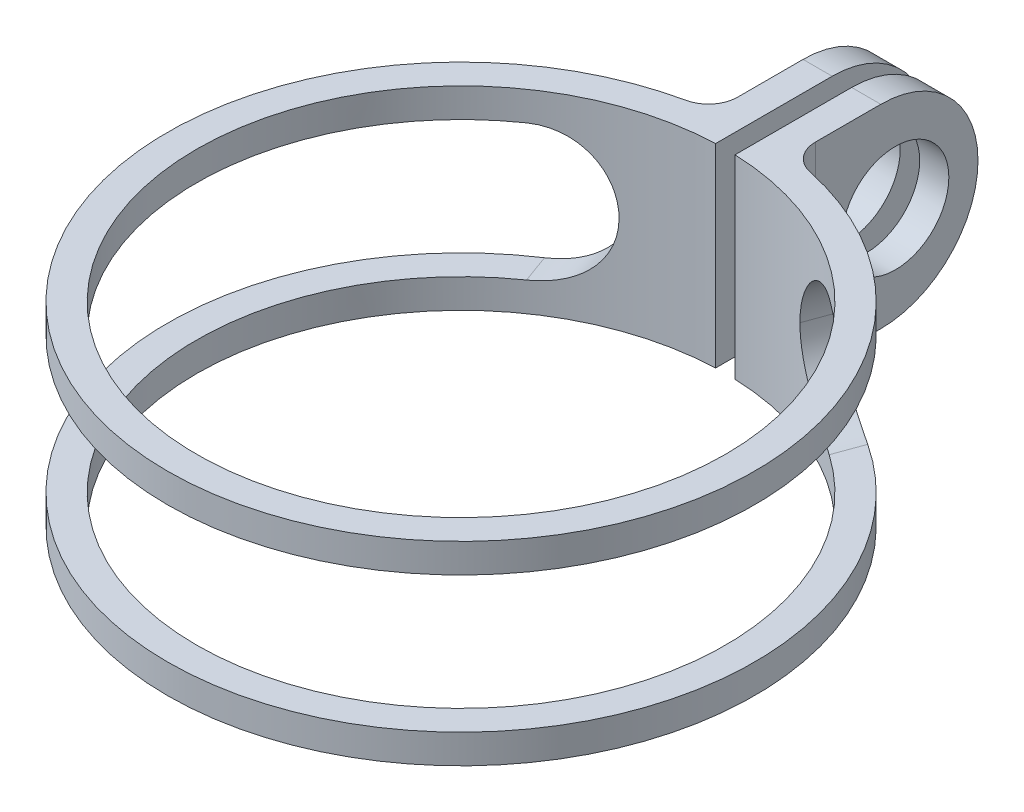
ISO-10303-21;
HEADER;
FILE_DESCRIPTION(('STEP AP214'),'2;1');
FILE_NAME('part.step','',(''),(''),'','','');
FILE_SCHEMA(('AUTOMOTIVE_DESIGN { 1 0 10303 214 1 1 1 1 }'));
ENDSEC;
DATA;
#1=APPLICATION_CONTEXT('core data for automotive mechanical design processes');
#2=APPLICATION_PROTOCOL_DEFINITION('international standard','automotive_design',2000,#1);
#3=PRODUCT_CONTEXT('',#1,'mechanical');
#4=PRODUCT('Part','Part','',(#3));
#5=PRODUCT_RELATED_PRODUCT_CATEGORY('part','',(#4));
#6=PRODUCT_DEFINITION_FORMATION('','',#4);
#7=PRODUCT_DEFINITION_CONTEXT('part definition',#1,'design');
#8=PRODUCT_DEFINITION('design','',#6,#7);
#9=PRODUCT_DEFINITION_SHAPE('','',#8);
#10=(LENGTH_UNIT() NAMED_UNIT(*) SI_UNIT(.MILLI.,.METRE.));
#11=(NAMED_UNIT(*) PLANE_ANGLE_UNIT() SI_UNIT($,.RADIAN.));
#12=(NAMED_UNIT(*) SI_UNIT($,.STERADIAN.) SOLID_ANGLE_UNIT());
#13=UNCERTAINTY_MEASURE_WITH_UNIT(LENGTH_MEASURE(1.E-05),#10,'distance_accuracy_value','');
#14=(GEOMETRIC_REPRESENTATION_CONTEXT(3) GLOBAL_UNCERTAINTY_ASSIGNED_CONTEXT((#13)) GLOBAL_UNIT_ASSIGNED_CONTEXT((#10,
#11,#12)) REPRESENTATION_CONTEXT('',''));
#15=CARTESIAN_POINT('',(0.,0.,0.));
#16=DIRECTION('',(0.,0.,1.));
#17=DIRECTION('',(1.,0.,0.));
#18=AXIS2_PLACEMENT_3D('',#15,#16,#17);
#19=CARTESIAN_POINT('',(0.,10.,0.));
#20=DIRECTION('',(0.,-1.,0.));
#21=DIRECTION('',(0.,0.,-1.));
#22=AXIS2_PLACEMENT_3D('',#19,#20,#21);
#23=CYLINDRICAL_SURFACE('',#22,15.1);
#24=CARTESIAN_POINT('',(0.,8.5,0.));
#25=DIRECTION('',(0.,1.,0.));
#26=DIRECTION('',(0.,0.,1.));
#27=AXIS2_PLACEMENT_3D('',#24,#25,#26);
#28=CIRCLE('',#27,15.1);
#29=CARTESIAN_POINT('',(-8.31277981123432,8.5,-12.605859423694));
#30=VERTEX_POINT('',#29);
#31=CARTESIAN_POINT('',(8.31277981123432,8.5,-12.605859423694));
#32=VERTEX_POINT('',#31);
#33=EDGE_CURVE('E357',#30,#32,#28,.T.);
#34=ORIENTED_EDGE('',*,*,#33,.T.);
#35=CARTESIAN_POINT('',(8.31277981123432,8.5,-12.605859423694));
#36=CARTESIAN_POINT('',(8.23081119365416,8.50000986269873,-12.6599231711339));
#37=CARTESIAN_POINT('',(8.14830236853744,8.49608979926422,-12.7131749706866));
#38=CARTESIAN_POINT('',(7.98279785800521,8.48035203292611,-12.8177397302163));
#39=CARTESIAN_POINT('',(7.89980211467017,8.46853337078762,-12.8690524539049));
#40=CARTESIAN_POINT('',(7.73396711486584,8.43696623126963,-12.9693929263964));
#41=CARTESIAN_POINT('',(7.65112781313249,8.4172205843794,-13.01842148384));
#42=CARTESIAN_POINT('',(7.48626354607359,8.36987211157906,-13.1139221316061));
#43=CARTESIAN_POINT('',(7.40423852722173,8.34226980570783,-13.1603943908892));
#44=CARTESIAN_POINT('',(7.16015287882387,8.24772625016357,-13.2957393175927));
#45=CARTESIAN_POINT('',(7.00015777474126,8.16906274682416,-13.3804943431177));
#46=CARTESIAN_POINT('',(6.69167087332782,7.98252376494462,-13.5374147169593));
#47=CARTESIAN_POINT('',(6.54317389024262,7.87466155513694,-13.6095857593674));
#48=CARTESIAN_POINT('',(6.2646699978317,7.63434111962348,-13.7399871600411));
#49=CARTESIAN_POINT('',(6.13443607786597,7.50224310431098,-13.7983962612636));
#50=CARTESIAN_POINT('',(5.89452550453871,7.21614485882987,-13.902579954191));
#51=CARTESIAN_POINT('',(5.78485500833225,7.06213809288333,-13.9483507636377));
#52=CARTESIAN_POINT('',(5.58930067354855,6.73562818011307,-14.0278638366792));
#53=CARTESIAN_POINT('',(5.50355866191934,6.56302281837207,-14.0615347072593));
#54=CARTESIAN_POINT('',(5.3596984885654,6.20491743728262,-14.1169969091488));
#55=CARTESIAN_POINT('',(5.30156776647713,6.01942332512582,-14.138793642662));
#56=CARTESIAN_POINT('',(5.22715678555685,5.69434439184849,-14.166437552682));
#57=CARTESIAN_POINT('',(5.20369411341341,5.55658629029935,-14.1750505004116));
#58=CARTESIAN_POINT('',(5.17235900479763,5.27923654660502,-14.1864995662424));
#59=CARTESIAN_POINT('',(5.16446827882087,5.13964724953038,-14.1893424614763));
#60=CARTESIAN_POINT('',(5.16450416421751,5.,-14.1893585738672));
#61=B_SPLINE_CURVE_WITH_KNOTS('',3,(#35,#36,#37,#38,#39,#40,#41,#42,#43,#44,#45,#46,#47,#48,#49,
#50,#51,#52,#53,#54,#55,#56,#57,#58,#59,#60),.UNSPECIFIED.,.F.,.F.,(4,2,2,2,2,2,2,2,2,2,2,2,4),
(0.,0.294498317504663,0.589032406469113,0.883461419524911,1.17787094860585,1.76695650709933,
2.35577481624542,2.93646222029429,3.51732321862181,4.10155726752016,4.68552529347121,
5.10459670001931,5.52317560673861),.UNSPECIFIED.);
#62=CARTESIAN_POINT('',(5.16450416421751,4.99999999999999,-14.1893585738672));
#63=VERTEX_POINT('',#62);
#64=EDGE_CURVE('E49',#32,#63,#61,.T.);
#65=ORIENTED_EDGE('',*,*,#64,.T.);
#66=CARTESIAN_POINT('',(5.16450416421751,4.99999999999999,-14.1893585738672));
#67=CARTESIAN_POINT('',(5.16449287767635,4.90160916845923,-14.1893550666997));
#68=CARTESIAN_POINT('',(5.16840275736751,4.80322281109262,-14.1879394033939));
#69=CARTESIAN_POINT('',(5.1839786291241,4.6071530736506,-14.1822597436769));
#70=CARTESIAN_POINT('',(5.19564426669441,4.50946966165169,-14.1779958774493));
#71=CARTESIAN_POINT('',(5.22663518770833,4.31555492923873,-14.1665995684655));
#72=CARTESIAN_POINT('',(5.24595539550217,4.21932269037476,-14.1594690265199));
#73=CARTESIAN_POINT('',(5.29206350315528,4.02895788326821,-14.1423004887379));
#74=CARTESIAN_POINT('',(5.31885131154664,3.93482528932308,-14.1322625285133));
#75=CARTESIAN_POINT('',(5.41013528571553,3.65647940241752,-14.0976856781701));
#76=CARTESIAN_POINT('',(5.48556380689713,3.47624490814215,-14.0686796705259));
#77=CARTESIAN_POINT('',(5.66280451340452,3.13204786004916,-13.9982739193562));
#78=CARTESIAN_POINT('',(5.76461224906418,2.96808256837456,-13.9568762658804));
#79=CARTESIAN_POINT('',(5.99080881577567,2.66131212456748,-13.8612846338624));
#80=CARTESIAN_POINT('',(6.11514636039578,2.51846022449207,-13.8071196360963));
#81=CARTESIAN_POINT('',(6.38217686779834,2.25761697633735,-13.6857323828087));
#82=CARTESIAN_POINT('',(6.52486932619303,2.13962494535094,-13.6185104860611));
#83=CARTESIAN_POINT('',(6.82218908061032,1.93276838234129,-13.4720051002904));
#84=CARTESIAN_POINT('',(6.97669500353014,1.84364679936975,-13.3928378063661));
#85=CARTESIAN_POINT('',(7.29352852332426,1.69531808746068,-13.2229605194689));
#86=CARTESIAN_POINT('',(7.4558543992017,1.63610440910851,-13.1322530590832));
#87=CARTESIAN_POINT('',(7.73493087681044,1.56152513541092,-12.9691474268163));
#88=CARTESIAN_POINT('',(7.8510965546075,1.53839493963019,-12.8991738633733));
#89=CARTESIAN_POINT('',(8.08278032898155,1.50763048191294,-12.7552909879235));
#90=CARTESIAN_POINT('',(8.198299172597,1.49997101608021,-12.681388278984));
#91=CARTESIAN_POINT('',(8.31277981123432,1.49999999999999,-12.605859423694));
#92=B_SPLINE_CURVE_WITH_KNOTS('',3,(#66,#67,#68,#69,#70,#71,#72,#73,#74,#75,#76,#77,#78,#79,#80,
#81,#82,#83,#84,#85,#86,#87,#88,#89,#90,#91),.UNSPECIFIED.,.F.,.F.,(4,2,2,2,2,2,2,2,2,2,2,2,4),
(0.,0.295076581673485,0.590139677106172,0.885007446466768,1.17987160425836,1.76938024289676,
2.35878950742786,2.94687353322053,3.53494140208433,4.11761944522407,4.7001698346041,
5.11199810447748,5.52315490789495),.UNSPECIFIED.);
#93=CARTESIAN_POINT('',(8.31277981123432,1.49999999999999,-12.605859423694));
#94=VERTEX_POINT('',#93);
#95=EDGE_CURVE('E331',#63,#94,#92,.T.);
#96=ORIENTED_EDGE('',*,*,#95,.T.);
#97=CARTESIAN_POINT('',(0.,1.49999999999999,0.));
#98=DIRECTION('',(0.,-1.,0.));
#99=DIRECTION('',(0.,0.,-1.));
#100=AXIS2_PLACEMENT_3D('',#97,#98,#99);
#101=CIRCLE('',#100,15.1);
#102=CARTESIAN_POINT('',(-8.31277981123432,1.49999999999999,-12.605859423694));
#103=VERTEX_POINT('',#102);
#104=EDGE_CURVE('E263',#94,#103,#101,.T.);
#105=ORIENTED_EDGE('',*,*,#104,.T.);
#106=CARTESIAN_POINT('',(-8.31277981123432,1.49999999999999,-12.605859423694));
#107=CARTESIAN_POINT('',(-8.23081119365416,1.49999013730127,-12.6599231711339));
#108=CARTESIAN_POINT('',(-8.14830236853744,1.50391020073577,-12.7131749706866));
#109=CARTESIAN_POINT('',(-7.98279785800521,1.51964796707388,-12.8177397302163));
#110=CARTESIAN_POINT('',(-7.89980211467017,1.53146662921237,-12.8690524539049));
#111=CARTESIAN_POINT('',(-7.73396711486584,1.56303376873036,-12.9693929263964));
#112=CARTESIAN_POINT('',(-7.65112781313249,1.58277941562059,-13.01842148384));
#113=CARTESIAN_POINT('',(-7.48626354607359,1.63012788842094,-13.1139221316061));
#114=CARTESIAN_POINT('',(-7.40423852722173,1.65773019429216,-13.1603943908892));
#115=CARTESIAN_POINT('',(-7.16015287882387,1.75227374983643,-13.2957393175927));
#116=CARTESIAN_POINT('',(-7.00015777474126,1.83093725317584,-13.3804943431177));
#117=CARTESIAN_POINT('',(-6.69167087332782,2.01747623505538,-13.5374147169593));
#118=CARTESIAN_POINT('',(-6.54317389024262,2.12533844486305,-13.6095857593674));
#119=CARTESIAN_POINT('',(-6.2646699978317,2.36565888037652,-13.7399871600411));
#120=CARTESIAN_POINT('',(-6.13443607786597,2.49775689568902,-13.7983962612636));
#121=CARTESIAN_POINT('',(-5.89452550453871,2.78385514117013,-13.902579954191));
#122=CARTESIAN_POINT('',(-5.78485500833225,2.93786190711667,-13.9483507636377));
#123=CARTESIAN_POINT('',(-5.58930067354855,3.26437181988693,-14.0278638366792));
#124=CARTESIAN_POINT('',(-5.50355866191934,3.43697718162793,-14.0615347072593));
#125=CARTESIAN_POINT('',(-5.3596984885654,3.79508256271738,-14.1169969091488));
#126=CARTESIAN_POINT('',(-5.30156776647713,3.98057667487418,-14.138793642662));
#127=CARTESIAN_POINT('',(-5.22715678555685,4.30565560815151,-14.166437552682));
#128=CARTESIAN_POINT('',(-5.20369411341341,4.44341370970065,-14.1750505004116));
#129=CARTESIAN_POINT('',(-5.17235900479763,4.72076345339497,-14.1864995662424));
#130=CARTESIAN_POINT('',(-5.16446827882087,4.86035275046961,-14.1893424614763));
#131=CARTESIAN_POINT('',(-5.16450416421751,4.99999999999999,-14.1893585738672));
#132=B_SPLINE_CURVE_WITH_KNOTS('',3,(#106,#107,#108,#109,#110,#111,#112,#113,#114,#115,#116,
#117,#118,#119,#120,#121,#122,#123,#124,#125,#126,#127,#128,#129,#130,#131),.UNSPECIFIED.,.F.,
.F.,(4,2,2,2,2,2,2,2,2,2,2,2,4),(0.,0.294498317504661,0.589032406469111,0.883461419524912,
1.17787094860585,1.76695650709933,2.35577481624542,2.93646222029429,3.51732321862181,
4.10155726752017,4.68552529347122,5.10459670001931,5.52317560673861),.UNSPECIFIED.);
#133=CARTESIAN_POINT('',(-5.16450416421751,5.,-14.1893585738672));
#134=VERTEX_POINT('',#133);
#135=EDGE_CURVE('E320',#103,#134,#132,.T.);
#136=ORIENTED_EDGE('',*,*,#135,.T.);
#137=CARTESIAN_POINT('',(-5.16450416421751,5.,-14.1893585738672));
#138=CARTESIAN_POINT('',(-5.16449287767635,5.09839083154077,-14.1893550666997));
#139=CARTESIAN_POINT('',(-5.16840275736751,5.19677718890737,-14.1879394033939));
#140=CARTESIAN_POINT('',(-5.1839786291241,5.39284692634939,-14.1822597436769));
#141=CARTESIAN_POINT('',(-5.19564426669441,5.49053033834831,-14.1779958774493));
#142=CARTESIAN_POINT('',(-5.22663518770833,5.68444507076127,-14.1665995684655));
#143=CARTESIAN_POINT('',(-5.24595539550217,5.78067730962523,-14.1594690265199));
#144=CARTESIAN_POINT('',(-5.29206350315528,5.97104211673179,-14.1423004887379));
#145=CARTESIAN_POINT('',(-5.31885131154664,6.06517471067691,-14.1322625285133));
#146=CARTESIAN_POINT('',(-5.41013528571553,6.34352059758248,-14.0976856781701));
#147=CARTESIAN_POINT('',(-5.48556380689713,6.52375509185785,-14.0686796705259));
#148=CARTESIAN_POINT('',(-5.66280451340452,6.86795213995083,-13.9982739193562));
#149=CARTESIAN_POINT('',(-5.76461224906418,7.03191743162543,-13.9568762658804));
#150=CARTESIAN_POINT('',(-5.99080881577567,7.33868787543251,-13.8612846338624));
#151=CARTESIAN_POINT('',(-6.11514636039578,7.48153977550793,-13.8071196360963));
#152=CARTESIAN_POINT('',(-6.38217686779834,7.74238302366265,-13.6857323828087));
#153=CARTESIAN_POINT('',(-6.52486932619303,7.86037505464906,-13.6185104860611));
#154=CARTESIAN_POINT('',(-6.82218908061033,8.06723161765871,-13.4720051002904));
#155=CARTESIAN_POINT('',(-6.97669500353014,8.15635320063025,-13.3928378063661));
#156=CARTESIAN_POINT('',(-7.29352852332426,8.30468191253932,-13.2229605194689));
#157=CARTESIAN_POINT('',(-7.4558543992017,8.36389559089149,-13.1322530590832));
#158=CARTESIAN_POINT('',(-7.73493087681044,8.43847486458907,-12.9691474268163));
#159=CARTESIAN_POINT('',(-7.8510965546075,8.46160506036981,-12.8991738633733));
#160=CARTESIAN_POINT('',(-8.08278032898155,8.49236951808705,-12.7552909879235));
#161=CARTESIAN_POINT('',(-8.19829917259699,8.50002898391978,-12.681388278984));
#162=CARTESIAN_POINT('',(-8.31277981123432,8.5,-12.605859423694));
#163=B_SPLINE_CURVE_WITH_KNOTS('',3,(#137,#138,#139,#140,#141,#142,#143,#144,#145,#146,#147,
#148,#149,#150,#151,#152,#153,#154,#155,#156,#157,#158,#159,#160,#161,#162),.UNSPECIFIED.,.F.,
.F.,(4,2,2,2,2,2,2,2,2,2,2,2,4),(0.,0.295076581673485,0.590139677106172,0.885007446466769,
1.17987160425836,1.76938024289676,2.35878950742786,2.94687353322053,3.53494140208434,
4.11761944522408,4.7001698346041,5.11199810447748,5.52315490789495),.UNSPECIFIED.);
#164=EDGE_CURVE('E279',#134,#30,#163,.T.);
#165=ORIENTED_EDGE('',*,*,#164,.T.);
#166=EDGE_LOOP('',(#34,#65,#96,#105,#136,#165));
#167=FACE_BOUND('',#166,.T.);
#168=CARTESIAN_POINT('',(0.,10.,0.));
#169=DIRECTION('',(0.,1.,0.));
#170=DIRECTION('',(1.,0.,0.));
#171=AXIS2_PLACEMENT_3D('',#168,#169,#170);
#172=CIRCLE('',#171,15.1);
#173=CARTESIAN_POINT('',(-3.18373493975904,10.,-14.7605498486119));
#174=VERTEX_POINT('',#173);
#175=CARTESIAN_POINT('',(3.18373493975904,10.,-14.7605498486119));
#176=VERTEX_POINT('',#175);
#177=EDGE_CURVE('E202',#174,#176,#172,.T.);
#178=ORIENTED_EDGE('',*,*,#177,.F.);
#179=DIRECTION('',(0.,-1.,0.));
#180=VECTOR('',#179,1.);
#181=CARTESIAN_POINT('',(-3.18373493975903,10.,-14.7605498486119));
#182=LINE('',#181,#180);
#183=CARTESIAN_POINT('',(-3.18373493975904,0.,-14.7605498486119));
#184=VERTEX_POINT('',#183);
#185=EDGE_CURVE('E218',#174,#184,#182,.T.);
#186=ORIENTED_EDGE('',*,*,#185,.T.);
#187=CARTESIAN_POINT('',(0.,0.,0.));
#188=DIRECTION('',(0.,1.,0.));
#189=DIRECTION('',(1.,0.,0.));
#190=AXIS2_PLACEMENT_3D('',#187,#188,#189);
#191=CIRCLE('',#190,15.1);
#192=CARTESIAN_POINT('',(3.18373493975904,0.,-14.7605498486119));
#193=VERTEX_POINT('',#192);
#194=EDGE_CURVE('E196',#184,#193,#191,.T.);
#195=ORIENTED_EDGE('',*,*,#194,.T.);
#196=DIRECTION('',(0.,-1.,0.));
#197=VECTOR('',#196,1.);
#198=CARTESIAN_POINT('',(3.18373493975903,10.,-14.7605498486119));
#199=LINE('',#198,#197);
#200=EDGE_CURVE('E215',#193,#176,#199,.F.);
#201=ORIENTED_EDGE('',*,*,#200,.T.);
#202=EDGE_LOOP('',(#178,#186,#195,#201));
#203=FACE_BOUND('',#202,.T.);
#204=ADVANCED_FACE('F39',(#167,#203),#23,.T.);
#205=CARTESIAN_POINT('',(0.,10.,0.));
#206=DIRECTION('',(0.,1.,0.));
#207=DIRECTION('',(0.,0.,1.));
#208=AXIS2_PLACEMENT_3D('',#205,#206,#207);
#209=PLANE('',#208);
#210=DIRECTION('',(0.,0.,1.));
#211=VECTOR('',#210,1.);
#212=CARTESIAN_POINT('',(-0.5,10.,-11.9297105240903));
#213=LINE('',#212,#211);
#214=CARTESIAN_POINT('',(-0.5,10.,-19.59080571563));
#215=VERTEX_POINT('',#214);
#216=CARTESIAN_POINT('',(-0.5,10.,-13.59080571563));
#217=VERTEX_POINT('',#216);
#218=EDGE_CURVE('E184',#215,#217,#213,.T.);
#219=ORIENTED_EDGE('',*,*,#218,.F.);
#220=DIRECTION('',(-1.,0.,0.));
#221=VECTOR('',#220,1.);
#222=CARTESIAN_POINT('',(-2.,10.,-19.59080571563));
#223=LINE('',#222,#221);
#224=CARTESIAN_POINT('',(-2.,10.,-19.59080571563));
#225=VERTEX_POINT('',#224);
#226=EDGE_CURVE('E255',#215,#225,#223,.T.);
#227=ORIENTED_EDGE('',*,*,#226,.T.);
#228=DIRECTION('',(0.,0.,1.));
#229=VECTOR('',#228,1.);
#230=CARTESIAN_POINT('',(-2.,10.,-24.59080571563));
#231=LINE('',#230,#229);
#232=CARTESIAN_POINT('',(-2.,10.,-16.2268296348979));
#233=VERTEX_POINT('',#232);
#234=EDGE_CURVE('E178',#225,#233,#231,.T.);
#235=ORIENTED_EDGE('',*,*,#234,.T.);
#236=CARTESIAN_POINT('',(-3.5,10.,-16.2268296348979));
#237=DIRECTION('',(0.,1.,0.));
#238=DIRECTION('',(0.,0.,1.));
#239=AXIS2_PLACEMENT_3D('',#236,#237,#238);
#240=CIRCLE('',#239,1.5);
#241=EDGE_CURVE('E223',#233,#174,#240,.F.);
#242=ORIENTED_EDGE('',*,*,#241,.T.);
#243=ORIENTED_EDGE('',*,*,#177,.T.);
#244=CARTESIAN_POINT('',(3.5,10.,-16.2268296348979));
#245=DIRECTION('',(0.,1.,0.));
#246=DIRECTION('',(0.,0.,1.));
#247=AXIS2_PLACEMENT_3D('',#244,#245,#246);
#248=CIRCLE('',#247,1.5);
#249=CARTESIAN_POINT('',(2.,10.,-16.2268296348979));
#250=VERTEX_POINT('',#249);
#251=EDGE_CURVE('E228',#176,#250,#248,.F.);
#252=ORIENTED_EDGE('',*,*,#251,.T.);
#253=DIRECTION('',(0.,0.,1.));
#254=VECTOR('',#253,1.);
#255=CARTESIAN_POINT('',(2.,10.,-24.59080571563));
#256=LINE('',#255,#254);
#257=CARTESIAN_POINT('',(2.,10.,-19.59080571563));
#258=VERTEX_POINT('',#257);
#259=EDGE_CURVE('E390',#258,#250,#256,.T.);
#260=ORIENTED_EDGE('',*,*,#259,.F.);
#261=DIRECTION('',(1.,0.,0.));
#262=VECTOR('',#261,1.);
#263=CARTESIAN_POINT('',(0.,10.,-19.59080571563));
#264=LINE('',#263,#262);
#265=CARTESIAN_POINT('',(0.5,10.,-19.59080571563));
#266=VERTEX_POINT('',#265);
#267=EDGE_CURVE('E253',#258,#266,#264,.F.);
#268=ORIENTED_EDGE('',*,*,#267,.T.);
#269=DIRECTION('',(0.,0.,-1.));
#270=VECTOR('',#269,1.);
#271=CARTESIAN_POINT('',(0.5,10.,-11.9297105240903));
#272=LINE('',#271,#270);
#273=CARTESIAN_POINT('',(0.5,10.,-13.59080571563));
#274=VERTEX_POINT('',#273);
#275=EDGE_CURVE('E194',#274,#266,#272,.T.);
#276=ORIENTED_EDGE('',*,*,#275,.F.);
#277=CARTESIAN_POINT('',(0.,10.,0.));
#278=DIRECTION('',(0.,1.,0.));
#279=DIRECTION('',(0.,0.,1.));
#280=AXIS2_PLACEMENT_3D('',#277,#278,#279);
#281=CIRCLE('',#280,13.6);
#282=EDGE_CURVE('E193',#217,#274,#281,.T.);
#283=ORIENTED_EDGE('',*,*,#282,.F.);
#284=EDGE_LOOP('',(#219,#227,#235,#242,#243,#252,#260,#268,#276,#283));
#285=FACE_BOUND('',#284,.T.);
#286=ADVANCED_FACE('F343',(#285),#209,.T.);
#287=CARTESIAN_POINT('',(0.,0.,0.));
#288=DIRECTION('',(0.,1.,0.));
#289=DIRECTION('',(0.,0.,1.));
#290=AXIS2_PLACEMENT_3D('',#287,#288,#289);
#291=PLANE('',#290);
#292=DIRECTION('',(0.,0.,-1.));
#293=VECTOR('',#292,1.);
#294=CARTESIAN_POINT('',(0.5,0.,-11.9297105240903));
#295=LINE('',#294,#293);
#296=CARTESIAN_POINT('',(0.5,0.,-13.59080571563));
#297=VERTEX_POINT('',#296);
#298=CARTESIAN_POINT('',(0.5,0.,-19.59080571563));
#299=VERTEX_POINT('',#298);
#300=EDGE_CURVE('E177',#297,#299,#295,.T.);
#301=ORIENTED_EDGE('',*,*,#300,.T.);
#302=DIRECTION('',(1.,0.,0.));
#303=VECTOR('',#302,1.);
#304=CARTESIAN_POINT('',(2.,0.,-19.59080571563));
#305=LINE('',#304,#303);
#306=CARTESIAN_POINT('',(2.,0.,-19.59080571563));
#307=VERTEX_POINT('',#306);
#308=EDGE_CURVE('E234',#299,#307,#305,.T.);
#309=ORIENTED_EDGE('',*,*,#308,.T.);
#310=DIRECTION('',(0.,0.,1.));
#311=VECTOR('',#310,1.);
#312=CARTESIAN_POINT('',(2.,0.,-24.59080571563));
#313=LINE('',#312,#311);
#314=CARTESIAN_POINT('',(2.,0.,-16.2268296348979));
#315=VERTEX_POINT('',#314);
#316=EDGE_CURVE('E389',#307,#315,#313,.T.);
#317=ORIENTED_EDGE('',*,*,#316,.T.);
#318=CARTESIAN_POINT('',(3.5,0.,-16.2268296348979));
#319=DIRECTION('',(0.,1.,0.));
#320=DIRECTION('',(0.,0.,1.));
#321=AXIS2_PLACEMENT_3D('',#318,#319,#320);
#322=CIRCLE('',#321,1.5);
#323=EDGE_CURVE('E231',#315,#193,#322,.T.);
#324=ORIENTED_EDGE('',*,*,#323,.T.);
#325=ORIENTED_EDGE('',*,*,#194,.F.);
#326=CARTESIAN_POINT('',(-3.5,0.,-16.2268296348979));
#327=DIRECTION('',(0.,1.,0.));
#328=DIRECTION('',(0.,0.,1.));
#329=AXIS2_PLACEMENT_3D('',#326,#327,#328);
#330=CIRCLE('',#329,1.5);
#331=CARTESIAN_POINT('',(-2.,0.,-16.2268296348979));
#332=VERTEX_POINT('',#331);
#333=EDGE_CURVE('E225',#184,#332,#330,.T.);
#334=ORIENTED_EDGE('',*,*,#333,.T.);
#335=DIRECTION('',(0.,0.,1.));
#336=VECTOR('',#335,1.);
#337=CARTESIAN_POINT('',(-2.,0.,-24.59080571563));
#338=LINE('',#337,#336);
#339=CARTESIAN_POINT('',(-2.,0.,-19.59080571563));
#340=VERTEX_POINT('',#339);
#341=EDGE_CURVE('E392',#340,#332,#338,.T.);
#342=ORIENTED_EDGE('',*,*,#341,.F.);
#343=DIRECTION('',(-1.,0.,0.));
#344=VECTOR('',#343,1.);
#345=CARTESIAN_POINT('',(0.,0.,-19.59080571563));
#346=LINE('',#345,#344);
#347=CARTESIAN_POINT('',(-0.5,0.,-19.59080571563));
#348=VERTEX_POINT('',#347);
#349=EDGE_CURVE('E175',#340,#348,#346,.F.);
#350=ORIENTED_EDGE('',*,*,#349,.T.);
#351=DIRECTION('',(0.,0.,1.));
#352=VECTOR('',#351,1.);
#353=CARTESIAN_POINT('',(-0.5,0.,-11.9297105240903));
#354=LINE('',#353,#352);
#355=CARTESIAN_POINT('',(-0.5,0.,-13.59080571563));
#356=VERTEX_POINT('',#355);
#357=EDGE_CURVE('E167',#348,#356,#354,.T.);
#358=ORIENTED_EDGE('',*,*,#357,.T.);
#359=CARTESIAN_POINT('',(0.,0.,0.));
#360=DIRECTION('',(0.,1.,0.));
#361=DIRECTION('',(0.,0.,1.));
#362=AXIS2_PLACEMENT_3D('',#359,#360,#361);
#363=CIRCLE('',#362,13.6);
#364=EDGE_CURVE('E172',#356,#297,#363,.T.);
#365=ORIENTED_EDGE('',*,*,#364,.T.);
#366=EDGE_LOOP('',(#301,#309,#317,#324,#325,#334,#342,#350,#358,#365));
#367=FACE_BOUND('',#366,.T.);
#368=ADVANCED_FACE('F170',(#367),#291,.F.);
#369=CARTESIAN_POINT('',(0.,10.,0.));
#370=DIRECTION('',(0.,-1.,0.));
#371=DIRECTION('',(0.,0.,-1.));
#372=AXIS2_PLACEMENT_3D('',#369,#370,#371);
#373=CYLINDRICAL_SURFACE('',#372,13.6);
#374=CARTESIAN_POINT('',(-7.78372473723183,8.5,-11.1522925542242));
#375=CARTESIAN_POINT('',(-7.70325913137186,8.50001113933572,-11.2084656302146));
#376=CARTESIAN_POINT('',(-7.62216713672474,8.49614656117007,-11.26375656854));
#377=CARTESIAN_POINT('',(-7.4593193868896,8.48060701235938,-11.3722493559889));
#378=CARTESIAN_POINT('',(-7.37756352825304,8.46893080044092,-11.4254508716793));
#379=CARTESIAN_POINT('',(-7.21402425357377,8.43771303786002,-11.5294084394965));
#380=CARTESIAN_POINT('',(-7.13224085019044,8.41817352935272,-11.5801651227348));
#381=CARTESIAN_POINT('',(-6.96928806156408,8.37126164474086,-11.6789595889132));
#382=CARTESIAN_POINT('',(-6.88811862888472,8.34388988024644,-11.7269975838012));
#383=CARTESIAN_POINT('',(-6.72695673182288,8.2813722310057,-11.8201832016624));
#384=CARTESIAN_POINT('',(-6.64696604525552,8.2462156754867,-11.8653267465537));
#385=CARTESIAN_POINT('',(-6.48894735434169,8.16832143856647,-11.9524770808578));
#386=CARTESIAN_POINT('',(-6.41092009432223,8.12558093012196,-11.9944826922281));
#387=CARTESIAN_POINT('',(-6.25762094158002,8.03282324221085,-12.0751676590221));
#388=CARTESIAN_POINT('',(-6.18234666341868,7.98281255869383,-12.1138499352869));
#389=CARTESIAN_POINT('',(-6.03515632402498,7.87582568347091,-12.1878500209368));
#390=CARTESIAN_POINT('',(-5.96324151014407,7.8188469325237,-12.223166585634));
#391=CARTESIAN_POINT('',(-5.75596998868512,7.64010865220971,-12.322823286825));
#392=CARTESIAN_POINT('',(-5.62628184095816,7.50884841819098,-12.3823244760214));
#393=CARTESIAN_POINT('',(-5.38710085957293,7.22453438895548,-12.4882485282725));
#394=CARTESIAN_POINT('',(-5.27761454967401,7.07147358187656,-12.5346671691365));
#395=CARTESIAN_POINT('',(-5.08192692601355,6.746675539107,-12.6152811665615));
#396=CARTESIAN_POINT('',(-4.99589288728949,6.57481579149587,-12.6493892483129));
#397=CARTESIAN_POINT('',(-4.85119829461837,6.2181450504153,-12.7055865006197));
#398=CARTESIAN_POINT('',(-4.79252611809766,6.03333959437005,-12.7276807749762));
#399=CARTESIAN_POINT('',(-4.71637738064988,5.70661655230128,-12.7560570315257));
#400=CARTESIAN_POINT('',(-4.69207544562985,5.5664728395706,-12.7649894095587));
#401=CARTESIAN_POINT('',(-4.65961211426501,5.28423698675589,-12.7768574361219));
#402=CARTESIAN_POINT('',(-4.6514328159624,5.14214718433108,-12.7797997359248));
#403=CARTESIAN_POINT('',(-4.65147394922902,5.,-12.7798196426884));
#404=B_SPLINE_CURVE_WITH_KNOTS('',3,(#374,#375,#376,#377,#378,#379,#380,#381,#382,#383,#384,
#385,#386,#387,#388,#389,#390,#391,#392,#393,#394,#395,#396,#397,#398,#399,#400,#401,#402,#403),
.UNSPECIFIED.,.F.,.F.,(4,2,2,2,2,2,2,2,2,2,2,2,2,2,4),(0.,0.294330509202449,0.588707798815956,
0.883008685800498,1.1772865975011,1.47197040682217,1.76676429603814,2.06129638570905,
2.35593697825848,2.9345969843628,3.51344353076688,4.09631669723604,4.67894204904083,
5.10548237715808,5.53154882385695),.UNSPECIFIED.);
#405=CARTESIAN_POINT('',(-7.78372473723183,8.5,-11.1522925542242));
#406=VERTEX_POINT('',#405);
#407=CARTESIAN_POINT('',(-4.65147394922902,5.,-12.7798196426884));
#408=VERTEX_POINT('',#407);
#409=EDGE_CURVE('E287',#406,#408,#404,.T.);
#410=ORIENTED_EDGE('',*,*,#409,.T.);
#411=CARTESIAN_POINT('',(-4.65147394922902,4.99999999999999,-12.7798196426884));
#412=CARTESIAN_POINT('',(-4.65146239986453,4.90162136250165,-12.7798153955717));
#413=CARTESIAN_POINT('',(-4.65537156967133,4.80324719993517,-12.7784008045204));
#414=CARTESIAN_POINT('',(-4.67094321531244,4.60720154133535,-12.7727215298757));
#415=CARTESIAN_POINT('',(-4.68260534085704,4.50953001375746,-12.7684569750477));
#416=CARTESIAN_POINT('',(-4.71358486517136,4.31563638576584,-12.7570520233984));
#417=CARTESIAN_POINT('',(-4.73289736043216,4.21941339783597,-12.7499134686213));
#418=CARTESIAN_POINT('',(-4.77898185691589,4.02906651515285,-12.7327110774849));
#419=CARTESIAN_POINT('',(-4.80575376669733,3.93494259468339,-12.7226472769846));
#420=CARTESIAN_POINT('',(-4.89697104238308,3.65662041831545,-12.6879461860752));
#421=CARTESIAN_POINT('',(-4.97232954402203,3.47640001766605,-12.658795150718));
#422=CARTESIAN_POINT('',(-5.14932362105782,3.13223200114778,-12.5878311036418));
#423=CARTESIAN_POINT('',(-5.25095480117007,2.96828166972254,-12.5460202096521));
#424=CARTESIAN_POINT('',(-5.4765530062912,2.66163449905303,-12.4491908632319));
#425=CARTESIAN_POINT('',(-5.6004574586798,2.5188801144487,-12.3942092710787));
#426=CARTESIAN_POINT('',(-5.86630391255497,2.25823886562866,-12.2706114998972));
#427=CARTESIAN_POINT('',(-6.00824449941917,2.14035005306627,-12.2019963899446));
#428=CARTESIAN_POINT('',(-6.30331281321858,1.93391040916496,-12.0521900678597));
#429=CARTESIAN_POINT('',(-6.45629598002286,1.8450430728477,-11.9711497478076));
#430=CARTESIAN_POINT('',(-6.76952258400552,1.69701782087551,-11.796848134374));
#431=CARTESIAN_POINT('',(-6.92976503316744,1.63785587536727,-11.7035885008384));
#432=CARTESIAN_POINT('',(-7.2066816719284,1.56257571841258,-11.5343908047209));
#433=CARTESIAN_POINT('',(-7.32293687148782,1.53903186023511,-11.4609558711605));
#434=CARTESIAN_POINT('',(-7.55445039303272,1.50774096895698,-11.3097127058183));
#435=CARTESIAN_POINT('',(-7.66971005942372,1.49996752141736,-11.2319120114585));
#436=CARTESIAN_POINT('',(-7.78372473723183,1.49999999999999,-11.1522925542242));
#437=B_SPLINE_CURVE_WITH_KNOTS('',3,(#411,#412,#413,#414,#415,#416,#417,#418,#419,#420,#421,
#422,#423,#424,#425,#426,#427,#428,#429,#430,#431,#432,#433,#434,#435,#436),.UNSPECIFIED.,.F.,
.F.,(4,2,2,2,2,2,2,2,2,2,2,2,4),(0.,0.295040029886112,0.590066730344371,0.88490463843732,
1.17973893240872,1.76919195060458,2.35854642007384,2.94627037171177,3.53394825500528,
4.11498451867315,4.69594193725884,5.1135408323736,5.53043969639389),.UNSPECIFIED.);
#438=CARTESIAN_POINT('',(-7.78372473723183,1.49999999999999,-11.1522925542242));
#439=VERTEX_POINT('',#438);
#440=EDGE_CURVE('E314',#408,#439,#437,.T.);
#441=ORIENTED_EDGE('',*,*,#440,.T.);
#442=CARTESIAN_POINT('',(0.,1.49999999999999,0.));
#443=DIRECTION('',(0.,-1.,0.));
#444=DIRECTION('',(0.,0.,-1.));
#445=AXIS2_PLACEMENT_3D('',#442,#443,#444);
#446=CIRCLE('',#445,13.6);
#447=CARTESIAN_POINT('',(7.78372473723183,1.49999999999999,-11.1522925542242));
#448=VERTEX_POINT('',#447);
#449=EDGE_CURVE('E266',#448,#439,#446,.T.);
#450=ORIENTED_EDGE('',*,*,#449,.F.);
#451=CARTESIAN_POINT('',(7.78372473723183,1.49999999999999,-11.1522925542242));
#452=CARTESIAN_POINT('',(7.70325913137186,1.49998886066428,-11.2084656302146));
#453=CARTESIAN_POINT('',(7.62216713672474,1.50385343882993,-11.26375656854));
#454=CARTESIAN_POINT('',(7.4593193868896,1.51939298764062,-11.3722493559889));
#455=CARTESIAN_POINT('',(7.37756352825304,1.53106919955908,-11.4254508716793));
#456=CARTESIAN_POINT('',(7.21402425357377,1.56228696213997,-11.5294084394965));
#457=CARTESIAN_POINT('',(7.13224085019044,1.58182647064728,-11.5801651227348));
#458=CARTESIAN_POINT('',(6.96928806156408,1.62873835525914,-11.6789595889132));
#459=CARTESIAN_POINT('',(6.88811862888472,1.65611011975355,-11.7269975838012));
#460=CARTESIAN_POINT('',(6.72695673182288,1.7186277689943,-11.8201832016624));
#461=CARTESIAN_POINT('',(6.64696604525552,1.7537843245133,-11.8653267465537));
#462=CARTESIAN_POINT('',(6.48894735434169,1.83167856143353,-11.9524770808578));
#463=CARTESIAN_POINT('',(6.41092009432223,1.87441906987803,-11.9944826922281));
#464=CARTESIAN_POINT('',(6.25762094158002,1.96717675778915,-12.0751676590221));
#465=CARTESIAN_POINT('',(6.18234666341868,2.01718744130617,-12.1138499352869));
#466=CARTESIAN_POINT('',(6.03515632402499,2.12417431652909,-12.1878500209368));
#467=CARTESIAN_POINT('',(5.96324151014407,2.1811530674763,-12.223166585634));
#468=CARTESIAN_POINT('',(5.75596998868512,2.35989134779028,-12.322823286825));
#469=CARTESIAN_POINT('',(5.62628184095816,2.49115158180901,-12.3823244760214));
#470=CARTESIAN_POINT('',(5.38710085957293,2.77546561104451,-12.4882485282725));
#471=CARTESIAN_POINT('',(5.27761454967401,2.92852641812344,-12.5346671691365));
#472=CARTESIAN_POINT('',(5.08192692601355,3.25332446089299,-12.6152811665615));
#473=CARTESIAN_POINT('',(4.99589288728949,3.42518420850413,-12.6493892483129));
#474=CARTESIAN_POINT('',(4.85119829461837,3.78185494958469,-12.7055865006197));
#475=CARTESIAN_POINT('',(4.79252611809766,3.96666040562995,-12.7276807749762));
#476=CARTESIAN_POINT('',(4.71637738064988,4.29338344769871,-12.7560570315257));
#477=CARTESIAN_POINT('',(4.69207544562985,4.43352716042939,-12.7649894095587));
#478=CARTESIAN_POINT('',(4.65961211426501,4.71576301324411,-12.7768574361219));
#479=CARTESIAN_POINT('',(4.6514328159624,4.85785281566892,-12.7797997359248));
#480=CARTESIAN_POINT('',(4.65147394922902,4.99999999999999,-12.7798196426884));
#481=B_SPLINE_CURVE_WITH_KNOTS('',3,(#451,#452,#453,#454,#455,#456,#457,#458,#459,#460,#461,
#462,#463,#464,#465,#466,#467,#468,#469,#470,#471,#472,#473,#474,#475,#476,#477,#478,#479,#480),
.UNSPECIFIED.,.F.,.F.,(4,2,2,2,2,2,2,2,2,2,2,2,2,2,4),(0.,0.294330509202449,0.588707798815957,
0.883008685800498,1.1772865975011,1.47197040682217,1.76676429603814,2.06129638570905,
2.35593697825848,2.9345969843628,3.51344353076688,4.09631669723604,4.67894204904083,
5.10548237715808,5.53154882385695),.UNSPECIFIED.);
#482=CARTESIAN_POINT('',(4.65147394922902,4.99999999999999,-12.7798196426884));
#483=VERTEX_POINT('',#482);
#484=EDGE_CURVE('E63',#448,#483,#481,.T.);
#485=ORIENTED_EDGE('',*,*,#484,.T.);
#486=CARTESIAN_POINT('',(4.65147394922902,5.,-12.7798196426884));
#487=CARTESIAN_POINT('',(4.65146239986453,5.09837863749835,-12.7798153955717));
#488=CARTESIAN_POINT('',(4.65537156967133,5.19675280006482,-12.7784008045204));
#489=CARTESIAN_POINT('',(4.67094321531244,5.39279845866465,-12.7727215298757));
#490=CARTESIAN_POINT('',(4.68260534085704,5.49046998624254,-12.7684569750477));
#491=CARTESIAN_POINT('',(4.71358486517136,5.68436361423416,-12.7570520233984));
#492=CARTESIAN_POINT('',(4.73289736043216,5.78058660216403,-12.7499134686213));
#493=CARTESIAN_POINT('',(4.77898185691589,5.97093348484714,-12.7327110774849));
#494=CARTESIAN_POINT('',(4.80575376669733,6.0650574053166,-12.7226472769846));
#495=CARTESIAN_POINT('',(4.89697104238308,6.34337958168454,-12.6879461860752));
#496=CARTESIAN_POINT('',(4.97232954402203,6.52359998233395,-12.658795150718));
#497=CARTESIAN_POINT('',(5.14932362105782,6.86776799885222,-12.5878311036418));
#498=CARTESIAN_POINT('',(5.25095480117007,7.03171833027745,-12.5460202096521));
#499=CARTESIAN_POINT('',(5.4765530062912,7.33836550094696,-12.4491908632319));
#500=CARTESIAN_POINT('',(5.6004574586798,7.48111988555129,-12.3942092710787));
#501=CARTESIAN_POINT('',(5.86630391255497,7.74176113437134,-12.2706114998972));
#502=CARTESIAN_POINT('',(6.00824449941917,7.85964994693373,-12.2019963899446));
#503=CARTESIAN_POINT('',(6.30331281321858,8.06608959083503,-12.0521900678597));
#504=CARTESIAN_POINT('',(6.45629598002286,8.15495692715229,-11.9711497478076));
#505=CARTESIAN_POINT('',(6.76952258400552,8.30298217912448,-11.796848134374));
#506=CARTESIAN_POINT('',(6.92976503316744,8.36214412463272,-11.7035885008384));
#507=CARTESIAN_POINT('',(7.2066816719284,8.43742428158741,-11.5343908047209));
#508=CARTESIAN_POINT('',(7.32293687148782,8.46096813976488,-11.4609558711605));
#509=CARTESIAN_POINT('',(7.55445039303272,8.49225903104301,-11.3097127058183));
#510=CARTESIAN_POINT('',(7.66971005942372,8.50003247858263,-11.2319120114585));
#511=CARTESIAN_POINT('',(7.78372473723183,8.5,-11.1522925542242));
#512=B_SPLINE_CURVE_WITH_KNOTS('',3,(#486,#487,#488,#489,#490,#491,#492,#493,#494,#495,#496,
#497,#498,#499,#500,#501,#502,#503,#504,#505,#506,#507,#508,#509,#510,#511),.UNSPECIFIED.,.F.,
.F.,(4,2,2,2,2,2,2,2,2,2,2,2,4),(0.,0.295040029886112,0.590066730344371,0.88490463843732,
1.17973893240871,1.76919195060458,2.35854642007384,2.94627037171177,3.53394825500528,
4.11498451867315,4.69594193725884,5.1135408323736,5.53043969639389),.UNSPECIFIED.);
#513=CARTESIAN_POINT('',(7.78372473723183,8.5,-11.1522925542242));
#514=VERTEX_POINT('',#513);
#515=EDGE_CURVE('E12',#483,#514,#512,.T.);
#516=ORIENTED_EDGE('',*,*,#515,.T.);
#517=CARTESIAN_POINT('',(0.,8.5,0.));
#518=DIRECTION('',(0.,1.,0.));
#519=DIRECTION('',(0.,0.,1.));
#520=AXIS2_PLACEMENT_3D('',#517,#518,#519);
#521=CIRCLE('',#520,13.6);
#522=EDGE_CURVE('E257',#406,#514,#521,.T.);
#523=ORIENTED_EDGE('',*,*,#522,.F.);
#524=EDGE_LOOP('',(#410,#441,#450,#485,#516,#523));
#525=FACE_BOUND('',#524,.T.);
#526=ORIENTED_EDGE('',*,*,#364,.F.);
#527=DIRECTION('',(0.,-1.,0.));
#528=VECTOR('',#527,1.);
#529=CARTESIAN_POINT('',(-0.5,10.,-13.59080571563));
#530=LINE('',#529,#528);
#531=EDGE_CURVE('E181',#356,#217,#530,.F.);
#532=ORIENTED_EDGE('',*,*,#531,.T.);
#533=ORIENTED_EDGE('',*,*,#282,.T.);
#534=DIRECTION('',(0.,-1.,0.));
#535=VECTOR('',#534,1.);
#536=CARTESIAN_POINT('',(0.5,10.,-13.59080571563));
#537=LINE('',#536,#535);
#538=EDGE_CURVE('E189',#274,#297,#537,.T.);
#539=ORIENTED_EDGE('',*,*,#538,.T.);
#540=EDGE_LOOP('',(#526,#532,#533,#539));
#541=FACE_BOUND('',#540,.T.);
#542=ADVANCED_FACE('F192',(#525,#541),#373,.F.);
#543=CARTESIAN_POINT('',(0.5,10.,-11.9297105240903));
#544=DIRECTION('',(-1.,0.,0.));
#545=DIRECTION('',(0.,0.,1.));
#546=AXIS2_PLACEMENT_3D('',#543,#544,#545);
#547=PLANE('',#546);
#548=CARTESIAN_POINT('',(0.5,5.,-20.34080571563));
#549=DIRECTION('',(-1.,0.,0.));
#550=DIRECTION('',(0.,0.,1.));
#551=AXIS2_PLACEMENT_3D('',#548,#549,#550);
#552=CIRCLE('',#551,2.75);
#553=CARTESIAN_POINT('',(0.5,5.,-17.59080571563));
#554=VERTEX_POINT('',#553);
#555=EDGE_CURVE('E386',#554,#554,#552,.T.);
#556=ORIENTED_EDGE('',*,*,#555,.F.);
#557=EDGE_LOOP('',(#556));
#558=FACE_BOUND('',#557,.T.);
#559=CARTESIAN_POINT('',(0.5,5.,-19.59080571563));
#560=DIRECTION('',(-1.,0.,0.));
#561=DIRECTION('',(0.,0.,1.));
#562=AXIS2_PLACEMENT_3D('',#559,#560,#561);
#563=CIRCLE('',#562,5.);
#564=CARTESIAN_POINT('',(0.5,5.,-24.59080571563));
#565=VERTEX_POINT('',#564);
#566=EDGE_CURVE('E241',#266,#565,#563,.T.);
#567=ORIENTED_EDGE('',*,*,#566,.T.);
#568=CARTESIAN_POINT('',(0.5,5.,-19.59080571563));
#569=DIRECTION('',(-1.,0.,0.));
#570=DIRECTION('',(0.,0.,1.));
#571=AXIS2_PLACEMENT_3D('',#568,#569,#570);
#572=CIRCLE('',#571,5.);
#573=EDGE_CURVE('E243',#565,#299,#572,.T.);
#574=ORIENTED_EDGE('',*,*,#573,.T.);
#575=ORIENTED_EDGE('',*,*,#300,.F.);
#576=ORIENTED_EDGE('',*,*,#538,.F.);
#577=ORIENTED_EDGE('',*,*,#275,.T.);
#578=EDGE_LOOP('',(#567,#574,#575,#576,#577));
#579=FACE_BOUND('',#578,.T.);
#580=ADVANCED_FACE('F341',(#558,#579),#547,.T.);
#581=CARTESIAN_POINT('',(-0.5,10.,-11.9297105240903));
#582=DIRECTION('',(1.,0.,0.));
#583=DIRECTION('',(0.,0.,-1.));
#584=AXIS2_PLACEMENT_3D('',#581,#582,#583);
#585=PLANE('',#584);
#586=CARTESIAN_POINT('',(-0.5,5.,-20.34080571563));
#587=DIRECTION('',(1.,0.,0.));
#588=DIRECTION('',(0.,0.,-1.));
#589=AXIS2_PLACEMENT_3D('',#586,#587,#588);
#590=CIRCLE('',#589,2.75);
#591=CARTESIAN_POINT('',(-0.5,5.,-23.09080571563));
#592=VERTEX_POINT('',#591);
#593=EDGE_CURVE('E383',#592,#592,#590,.T.);
#594=ORIENTED_EDGE('',*,*,#593,.F.);
#595=EDGE_LOOP('',(#594));
#596=FACE_BOUND('',#595,.T.);
#597=ORIENTED_EDGE('',*,*,#357,.F.);
#598=CARTESIAN_POINT('',(-0.5,5.,-19.59080571563));
#599=DIRECTION('',(1.,0.,0.));
#600=DIRECTION('',(0.,0.,-1.));
#601=AXIS2_PLACEMENT_3D('',#598,#599,#600);
#602=CIRCLE('',#601,5.);
#603=CARTESIAN_POINT('',(-0.5,5.,-24.59080571563));
#604=VERTEX_POINT('',#603);
#605=EDGE_CURVE('E251',#348,#604,#602,.T.);
#606=ORIENTED_EDGE('',*,*,#605,.T.);
#607=CARTESIAN_POINT('',(-0.5,5.,-19.59080571563));
#608=DIRECTION('',(1.,0.,0.));
#609=DIRECTION('',(0.,0.,-1.));
#610=AXIS2_PLACEMENT_3D('',#607,#608,#609);
#611=CIRCLE('',#610,5.);
#612=EDGE_CURVE('E249',#604,#215,#611,.T.);
#613=ORIENTED_EDGE('',*,*,#612,.T.);
#614=ORIENTED_EDGE('',*,*,#218,.T.);
#615=ORIENTED_EDGE('',*,*,#531,.F.);
#616=EDGE_LOOP('',(#597,#606,#613,#614,#615));
#617=FACE_BOUND('',#616,.T.);
#618=ADVANCED_FACE('F182',(#596,#617),#585,.T.);
#619=CARTESIAN_POINT('',(-2.,10.,-24.59080571563));
#620=DIRECTION('',(1.,0.,0.));
#621=DIRECTION('',(0.,0.,-1.));
#622=AXIS2_PLACEMENT_3D('',#619,#620,#621);
#623=PLANE('',#622);
#624=CARTESIAN_POINT('',(-2.,5.,-20.34080571563));
#625=DIRECTION('',(1.,0.,0.));
#626=DIRECTION('',(0.,0.,-1.));
#627=AXIS2_PLACEMENT_3D('',#624,#625,#626);
#628=CIRCLE('',#627,2.75);
#629=CARTESIAN_POINT('',(-2.,5.,-23.09080571563));
#630=VERTEX_POINT('',#629);
#631=EDGE_CURVE('E211',#630,#630,#628,.T.);
#632=ORIENTED_EDGE('',*,*,#631,.T.);
#633=EDGE_LOOP('',(#632));
#634=FACE_BOUND('',#633,.T.);
#635=CARTESIAN_POINT('',(-2.,5.,-19.59080571563));
#636=DIRECTION('',(1.,0.,0.));
#637=DIRECTION('',(0.,0.,-1.));
#638=AXIS2_PLACEMENT_3D('',#635,#636,#637);
#639=CIRCLE('',#638,5.);
#640=CARTESIAN_POINT('',(-2.,5.,-24.59080571563));
#641=VERTEX_POINT('',#640);
#642=EDGE_CURVE('E245',#225,#641,#639,.F.);
#643=ORIENTED_EDGE('',*,*,#642,.T.);
#644=CARTESIAN_POINT('',(-2.,5.,-19.59080571563));
#645=DIRECTION('',(1.,0.,0.));
#646=DIRECTION('',(0.,0.,-1.));
#647=AXIS2_PLACEMENT_3D('',#644,#645,#646);
#648=CIRCLE('',#647,5.);
#649=EDGE_CURVE('E247',#641,#340,#648,.F.);
#650=ORIENTED_EDGE('',*,*,#649,.T.);
#651=ORIENTED_EDGE('',*,*,#341,.T.);
#652=DIRECTION('',(0.,1.,0.));
#653=VECTOR('',#652,1.);
#654=CARTESIAN_POINT('',(-2.,10.,-16.2268296348979));
#655=LINE('',#654,#653);
#656=EDGE_CURVE('E188',#332,#233,#655,.T.);
#657=ORIENTED_EDGE('',*,*,#656,.T.);
#658=ORIENTED_EDGE('',*,*,#234,.F.);
#659=EDGE_LOOP('',(#643,#650,#651,#657,#658));
#660=FACE_BOUND('',#659,.T.);
#661=ADVANCED_FACE('F418',(#634,#660),#623,.F.);
#662=CARTESIAN_POINT('',(2.,10.,-24.59080571563));
#663=DIRECTION('',(1.,0.,0.));
#664=DIRECTION('',(0.,0.,-1.));
#665=AXIS2_PLACEMENT_3D('',#662,#663,#664);
#666=PLANE('',#665);
#667=CARTESIAN_POINT('',(2.,5.,-20.34080571563));
#668=DIRECTION('',(1.,0.,0.));
#669=DIRECTION('',(0.,0.,-1.));
#670=AXIS2_PLACEMENT_3D('',#667,#668,#669);
#671=CIRCLE('',#670,2.75);
#672=CARTESIAN_POINT('',(2.,5.,-23.09080571563));
#673=VERTEX_POINT('',#672);
#674=EDGE_CURVE('E208',#673,#673,#671,.T.);
#675=ORIENTED_EDGE('',*,*,#674,.F.);
#676=EDGE_LOOP('',(#675));
#677=FACE_BOUND('',#676,.T.);
#678=ORIENTED_EDGE('',*,*,#316,.F.);
#679=CARTESIAN_POINT('',(2.,5.,-19.59080571563));
#680=DIRECTION('',(1.,0.,0.));
#681=DIRECTION('',(0.,0.,-1.));
#682=AXIS2_PLACEMENT_3D('',#679,#680,#681);
#683=CIRCLE('',#682,5.);
#684=CARTESIAN_POINT('',(2.,5.,-24.59080571563));
#685=VERTEX_POINT('',#684);
#686=EDGE_CURVE('E239',#307,#685,#683,.T.);
#687=ORIENTED_EDGE('',*,*,#686,.T.);
#688=CARTESIAN_POINT('',(2.,5.,-19.59080571563));
#689=DIRECTION('',(1.,0.,0.));
#690=DIRECTION('',(0.,0.,-1.));
#691=AXIS2_PLACEMENT_3D('',#688,#689,#690);
#692=CIRCLE('',#691,5.);
#693=EDGE_CURVE('E237',#685,#258,#692,.T.);
#694=ORIENTED_EDGE('',*,*,#693,.T.);
#695=ORIENTED_EDGE('',*,*,#259,.T.);
#696=DIRECTION('',(0.,-1.,0.));
#697=VECTOR('',#696,1.);
#698=CARTESIAN_POINT('',(2.,10.,-16.2268296348979));
#699=LINE('',#698,#697);
#700=EDGE_CURVE('E220',#250,#315,#699,.T.);
#701=ORIENTED_EDGE('',*,*,#700,.T.);
#702=EDGE_LOOP('',(#678,#687,#694,#695,#701));
#703=FACE_BOUND('',#702,.T.);
#704=ADVANCED_FACE('F405',(#677,#703),#666,.T.);
#705=CARTESIAN_POINT('',(-15.1,5.,-20.34080571563));
#706=DIRECTION('',(1.,0.,0.));
#707=DIRECTION('',(0.,0.,-1.));
#708=AXIS2_PLACEMENT_3D('',#705,#706,#707);
#709=CYLINDRICAL_SURFACE('',#708,2.75);
#710=ORIENTED_EDGE('',*,*,#555,.T.);
#711=EDGE_LOOP('',(#710));
#712=FACE_BOUND('',#711,.T.);
#713=ORIENTED_EDGE('',*,*,#674,.T.);
#714=EDGE_LOOP('',(#713));
#715=FACE_BOUND('',#714,.T.);
#716=ADVANCED_FACE('F489',(#712,#715),#709,.F.);
#717=ORIENTED_EDGE('',*,*,#593,.T.);
#718=EDGE_LOOP('',(#717));
#719=FACE_BOUND('',#718,.T.);
#720=ORIENTED_EDGE('',*,*,#631,.F.);
#721=EDGE_LOOP('',(#720));
#722=FACE_BOUND('',#721,.T.);
#723=ADVANCED_FACE('F492',(#719,#722),#709,.F.);
#724=CARTESIAN_POINT('',(-3.5,10.,-16.2268296348979));
#725=DIRECTION('',(0.,-1.,0.));
#726=DIRECTION('',(0.,0.,-1.));
#727=AXIS2_PLACEMENT_3D('',#724,#725,#726);
#728=CYLINDRICAL_SURFACE('',#727,1.5);
#729=ORIENTED_EDGE('',*,*,#333,.F.);
#730=ORIENTED_EDGE('',*,*,#185,.F.);
#731=ORIENTED_EDGE('',*,*,#241,.F.);
#732=ORIENTED_EDGE('',*,*,#656,.F.);
#733=EDGE_LOOP('',(#729,#730,#731,#732));
#734=FACE_BOUND('',#733,.T.);
#735=ADVANCED_FACE('F516',(#734),#728,.F.);
#736=CARTESIAN_POINT('',(3.5,10.,-16.2268296348979));
#737=DIRECTION('',(0.,-1.,0.));
#738=DIRECTION('',(0.,0.,-1.));
#739=AXIS2_PLACEMENT_3D('',#736,#737,#738);
#740=CYLINDRICAL_SURFACE('',#739,1.5);
#741=ORIENTED_EDGE('',*,*,#323,.F.);
#742=ORIENTED_EDGE('',*,*,#700,.F.);
#743=ORIENTED_EDGE('',*,*,#251,.F.);
#744=ORIENTED_EDGE('',*,*,#200,.F.);
#745=EDGE_LOOP('',(#741,#742,#743,#744));
#746=FACE_BOUND('',#745,.T.);
#747=ADVANCED_FACE('F521',(#746),#740,.F.);
#748=CARTESIAN_POINT('',(0.5,5.,-19.59080571563));
#749=DIRECTION('',(1.,0.,0.));
#750=DIRECTION('',(0.,0.,-1.));
#751=AXIS2_PLACEMENT_3D('',#748,#749,#750);
#752=CYLINDRICAL_SURFACE('',#751,5.);
#753=DIRECTION('',(1.,0.,0.));
#754=VECTOR('',#753,1.);
#755=CARTESIAN_POINT('',(0.5,5.,-24.59080571563));
#756=LINE('',#755,#754);
#757=EDGE_CURVE('E212',#565,#685,#756,.T.);
#758=ORIENTED_EDGE('',*,*,#757,.F.);
#759=ORIENTED_EDGE('',*,*,#566,.F.);
#760=ORIENTED_EDGE('',*,*,#267,.F.);
#761=ORIENTED_EDGE('',*,*,#693,.F.);
#762=EDGE_LOOP('',(#758,#759,#760,#761));
#763=FACE_BOUND('',#762,.T.);
#764=ADVANCED_FACE('F409',(#763),#752,.T.);
#765=CARTESIAN_POINT('',(0.,5.,-19.59080571563));
#766=DIRECTION('',(-1.,0.,0.));
#767=DIRECTION('',(0.,0.,1.));
#768=AXIS2_PLACEMENT_3D('',#765,#766,#767);
#769=CYLINDRICAL_SURFACE('',#768,5.);
#770=ORIENTED_EDGE('',*,*,#573,.F.);
#771=ORIENTED_EDGE('',*,*,#757,.T.);
#772=ORIENTED_EDGE('',*,*,#686,.F.);
#773=ORIENTED_EDGE('',*,*,#308,.F.);
#774=EDGE_LOOP('',(#770,#771,#772,#773));
#775=FACE_BOUND('',#774,.T.);
#776=ADVANCED_FACE('F401',(#775),#769,.T.);
#777=CARTESIAN_POINT('',(0.,5.,-19.59080571563));
#778=DIRECTION('',(1.,0.,0.));
#779=DIRECTION('',(0.,0.,-1.));
#780=AXIS2_PLACEMENT_3D('',#777,#778,#779);
#781=CYLINDRICAL_SURFACE('',#780,5.);
#782=ORIENTED_EDGE('',*,*,#226,.F.);
#783=ORIENTED_EDGE('',*,*,#612,.F.);
#784=DIRECTION('',(-1.,0.,0.));
#785=VECTOR('',#784,1.);
#786=CARTESIAN_POINT('',(-0.5,5.,-24.59080571563));
#787=LINE('',#786,#785);
#788=EDGE_CURVE('E260',#641,#604,#787,.F.);
#789=ORIENTED_EDGE('',*,*,#788,.F.);
#790=ORIENTED_EDGE('',*,*,#642,.F.);
#791=EDGE_LOOP('',(#782,#783,#789,#790));
#792=FACE_BOUND('',#791,.T.);
#793=ADVANCED_FACE('F304',(#792),#781,.T.);
#794=CARTESIAN_POINT('',(-0.5,5.,-19.59080571563));
#795=DIRECTION('',(-1.,0.,0.));
#796=DIRECTION('',(0.,0.,1.));
#797=AXIS2_PLACEMENT_3D('',#794,#795,#796);
#798=CYLINDRICAL_SURFACE('',#797,5.);
#799=ORIENTED_EDGE('',*,*,#605,.F.);
#800=ORIENTED_EDGE('',*,*,#349,.F.);
#801=ORIENTED_EDGE('',*,*,#649,.F.);
#802=ORIENTED_EDGE('',*,*,#788,.T.);
#803=EDGE_LOOP('',(#799,#800,#801,#802));
#804=FACE_BOUND('',#803,.T.);
#805=ADVANCED_FACE('F448',(#804),#798,.T.);
#806=CARTESIAN_POINT('',(-1.21456561563667,1.49999999999999,-3.33699160340782));
#807=DIRECTION('',(0.,-1.,0.));
#808=DIRECTION('',(0.,0.,-1.));
#809=AXIS2_PLACEMENT_3D('',#806,#807,#808);
#810=PLANE('',#809);
#811=ORIENTED_EDGE('',*,*,#449,.T.);
#812=DIRECTION('',(0.342020143325663,0.,0.93969262078591));
#813=VECTOR('',#812,1.);
#814=CARTESIAN_POINT('',(-8.4534283369682,1.49999999999999,-12.9922880722274));
#815=LINE('',#814,#813);
#816=EDGE_CURVE('E277',#439,#103,#815,.F.);
#817=ORIENTED_EDGE('',*,*,#816,.T.);
#818=ORIENTED_EDGE('',*,*,#104,.F.);
#819=DIRECTION('',(-0.342020143325663,0.,0.93969262078591));
#820=VECTOR('',#819,1.);
#821=CARTESIAN_POINT('',(4.21933541341255,1.49999999999999,-1.35921337288546));
#822=LINE('',#821,#820);
#823=EDGE_CURVE('E274',#94,#448,#822,.T.);
#824=ORIENTED_EDGE('',*,*,#823,.T.);
#825=EDGE_LOOP('',(#811,#817,#818,#824));
#826=FACE_BOUND('',#825,.T.);
#827=ADVANCED_FACE('F374',(#826),#810,.F.);
#828=CARTESIAN_POINT('',(-1.21456561563667,8.5,-3.33699160340782));
#829=DIRECTION('',(0.,1.,0.));
#830=DIRECTION('',(0.,0.,1.));
#831=AXIS2_PLACEMENT_3D('',#828,#829,#830);
#832=PLANE('',#831);
#833=ORIENTED_EDGE('',*,*,#33,.F.);
#834=DIRECTION('',(-0.342020143325663,0.,-0.93969262078591));
#835=VECTOR('',#834,1.);
#836=CARTESIAN_POINT('',(-7.94039812197971,8.5,-11.5827491410486));
#837=LINE('',#836,#835);
#838=EDGE_CURVE('E271',#30,#406,#837,.F.);
#839=ORIENTED_EDGE('',*,*,#838,.T.);
#840=ORIENTED_EDGE('',*,*,#522,.T.);
#841=DIRECTION('',(0.342020143325663,0.,-0.93969262078591));
#842=VECTOR('',#841,1.);
#843=CARTESIAN_POINT('',(4.21933541341255,8.5,-1.35921337288546));
#844=LINE('',#843,#842);
#845=EDGE_CURVE('E269',#514,#32,#844,.T.);
#846=ORIENTED_EDGE('',*,*,#845,.T.);
#847=EDGE_LOOP('',(#833,#839,#840,#846));
#848=FACE_BOUND('',#847,.T.);
#849=ADVANCED_FACE('F309',(#848),#832,.F.);
#850=CARTESIAN_POINT('',(-3.28892417275069,4.99999999999999,1.19707050163982));
#851=DIRECTION('',(-0.342020143325663,0.,-0.93969262078591));
#852=DIRECTION('',(-0.939692620785911,0.,0.342020143325663));
#853=AXIS2_PLACEMENT_3D('',#850,#851,#852);
#854=CYLINDRICAL_SURFACE('',#853,3.5);
#855=ORIENTED_EDGE('',*,*,#816,.F.);
#856=ORIENTED_EDGE('',*,*,#440,.F.);
#857=DIRECTION('',(0.342020143325663,0.,0.93969262078591));
#858=VECTOR('',#857,1.);
#859=CARTESIAN_POINT('',(-4.65147394922902,4.99999999999999,-12.7798196426884));
#860=LINE('',#859,#858);
#861=EDGE_CURVE('E355',#134,#408,#860,.T.);
#862=ORIENTED_EDGE('',*,*,#861,.F.);
#863=ORIENTED_EDGE('',*,*,#135,.F.);
#864=EDGE_LOOP('',(#855,#856,#862,#863));
#865=FACE_BOUND('',#864,.T.);
#866=ADVANCED_FACE('F302',(#865),#854,.F.);
#867=CARTESIAN_POINT('',(-3.28892417275069,5.,1.19707050163982));
#868=DIRECTION('',(0.342020143325663,0.,0.93969262078591));
#869=DIRECTION('',(0.939692620785911,0.,-0.342020143325663));
#870=AXIS2_PLACEMENT_3D('',#867,#868,#869);
#871=CYLINDRICAL_SURFACE('',#870,3.5);
#872=ORIENTED_EDGE('',*,*,#409,.F.);
#873=ORIENTED_EDGE('',*,*,#838,.F.);
#874=ORIENTED_EDGE('',*,*,#164,.F.);
#875=ORIENTED_EDGE('',*,*,#861,.T.);
#876=EDGE_LOOP('',(#872,#873,#874,#875));
#877=FACE_BOUND('',#876,.T.);
#878=ADVANCED_FACE('F297',(#877),#871,.F.);
#879=CARTESIAN_POINT('',(4.21933541341255,5.,-1.35921337288546));
#880=DIRECTION('',(0.342020143325663,0.,-0.93969262078591));
#881=DIRECTION('',(-0.939692620785911,0.,-0.342020143325663));
#882=AXIS2_PLACEMENT_3D('',#879,#880,#881);
#883=CYLINDRICAL_SURFACE('',#882,3.5);
#884=DIRECTION('',(0.342020143325663,0.,-0.93969262078591));
#885=VECTOR('',#884,1.);
#886=CARTESIAN_POINT('',(0.,5.,0.));
#887=LINE('',#886,#885);
#888=EDGE_CURVE('E44',#63,#483,#887,.F.);
#889=ORIENTED_EDGE('',*,*,#888,.F.);
#890=ORIENTED_EDGE('',*,*,#64,.F.);
#891=ORIENTED_EDGE('',*,*,#845,.F.);
#892=ORIENTED_EDGE('',*,*,#515,.F.);
#893=EDGE_LOOP('',(#889,#890,#891,#892));
#894=FACE_BOUND('',#893,.T.);
#895=ADVANCED_FACE('F41',(#894),#883,.F.);
#896=CARTESIAN_POINT('',(4.21933541341255,4.99999999999999,-1.35921337288545));
#897=DIRECTION('',(-0.342020143325663,0.,0.93969262078591));
#898=DIRECTION('',(0.939692620785911,0.,0.342020143325663));
#899=AXIS2_PLACEMENT_3D('',#896,#897,#898);
#900=CYLINDRICAL_SURFACE('',#899,3.5);
#901=ORIENTED_EDGE('',*,*,#95,.F.);
#902=ORIENTED_EDGE('',*,*,#888,.T.);
#903=ORIENTED_EDGE('',*,*,#484,.F.);
#904=ORIENTED_EDGE('',*,*,#823,.F.);
#905=EDGE_LOOP('',(#901,#902,#903,#904));
#906=FACE_BOUND('',#905,.T.);
#907=ADVANCED_FACE('F311',(#906),#900,.F.);
#908=CLOSED_SHELL('',(#204,#286,#368,#542,#580,#618,#661,#704,#716,#723,#735,#747,#764,#776,
#793,#805,#827,#849,#866,#878,#895,#907));
#909=MANIFOLD_SOLID_BREP('B2',#908);
#910=ADVANCED_BREP_SHAPE_REPRESENTATION('',(#18,#909),#14);
#911=SHAPE_DEFINITION_REPRESENTATION(#9,#910);
ENDSEC;
END-ISO-10303-21;
